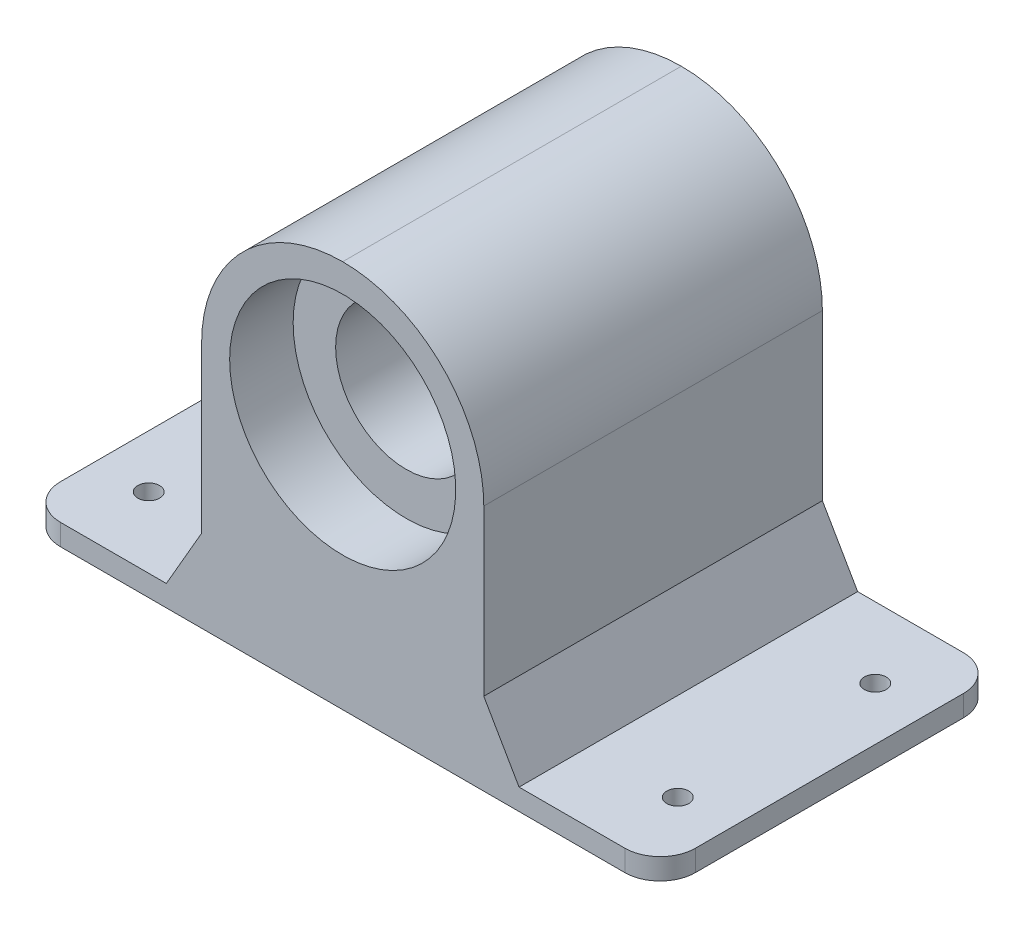
ISO-10303-21;
HEADER;
FILE_DESCRIPTION(('STEP AP214'),'2;1');
FILE_NAME('part.step','',(''),(''),'','','');
FILE_SCHEMA(('AUTOMOTIVE_DESIGN { 1 0 10303 214 1 1 1 1 }'));
ENDSEC;
DATA;
#1=APPLICATION_CONTEXT('core data for automotive mechanical design processes');
#2=APPLICATION_PROTOCOL_DEFINITION('international standard','automotive_design',2000,#1);
#3=PRODUCT_CONTEXT('',#1,'mechanical');
#4=PRODUCT('Part','Part','',(#3));
#5=PRODUCT_RELATED_PRODUCT_CATEGORY('part','',(#4));
#6=PRODUCT_DEFINITION_FORMATION('','',#4);
#7=PRODUCT_DEFINITION_CONTEXT('part definition',#1,'design');
#8=PRODUCT_DEFINITION('design','',#6,#7);
#9=PRODUCT_DEFINITION_SHAPE('','',#8);
#10=(LENGTH_UNIT() NAMED_UNIT(*) SI_UNIT(.MILLI.,.METRE.));
#11=(NAMED_UNIT(*) PLANE_ANGLE_UNIT() SI_UNIT($,.RADIAN.));
#12=(NAMED_UNIT(*) SI_UNIT($,.STERADIAN.) SOLID_ANGLE_UNIT());
#13=UNCERTAINTY_MEASURE_WITH_UNIT(LENGTH_MEASURE(1.E-05),#10,'distance_accuracy_value','');
#14=(GEOMETRIC_REPRESENTATION_CONTEXT(3) GLOBAL_UNCERTAINTY_ASSIGNED_CONTEXT((#13)) GLOBAL_UNIT_ASSIGNED_CONTEXT((#10,
#11,#12)) REPRESENTATION_CONTEXT('',''));
#15=CARTESIAN_POINT('',(0.,0.,0.));
#16=DIRECTION('',(0.,0.,1.));
#17=DIRECTION('',(1.,0.,0.));
#18=AXIS2_PLACEMENT_3D('',#15,#16,#17);
#19=CARTESIAN_POINT('',(20.,0.,24.));
#20=DIRECTION('',(-1.,0.,0.));
#21=DIRECTION('',(0.,0.,1.));
#22=AXIS2_PLACEMENT_3D('',#19,#20,#21);
#23=PLANE('',#22);
#24=DIRECTION('',(0.,1.,0.));
#25=VECTOR('',#24,1.);
#26=CARTESIAN_POINT('',(20.,0.,-24.));
#27=LINE('',#26,#25);
#28=CARTESIAN_POINT('',(20.,-23.3397459621555,-24.));
#29=VERTEX_POINT('',#28);
#30=CARTESIAN_POINT('',(20.,0.,-24.));
#31=VERTEX_POINT('',#30);
#32=EDGE_CURVE('E298',#29,#31,#27,.T.);
#33=ORIENTED_EDGE('',*,*,#32,.T.);
#34=DIRECTION('',(0.,0.,-1.));
#35=VECTOR('',#34,1.);
#36=CARTESIAN_POINT('',(20.,0.,24.));
#37=LINE('',#36,#35);
#38=CARTESIAN_POINT('',(20.,0.,24.));
#39=VERTEX_POINT('',#38);
#40=EDGE_CURVE('E209',#31,#39,#37,.F.);
#41=ORIENTED_EDGE('',*,*,#40,.T.);
#42=DIRECTION('',(0.,1.,0.));
#43=VECTOR('',#42,1.);
#44=CARTESIAN_POINT('',(20.,-35.,24.));
#45=LINE('',#44,#43);
#46=CARTESIAN_POINT('',(20.,-23.3397459621555,24.));
#47=VERTEX_POINT('',#46);
#48=EDGE_CURVE('E170',#47,#39,#45,.T.);
#49=ORIENTED_EDGE('',*,*,#48,.F.);
#50=DIRECTION('',(0.,0.,-1.));
#51=VECTOR('',#50,1.);
#52=CARTESIAN_POINT('',(20.,-23.3397459621555,-24.));
#53=LINE('',#52,#51);
#54=EDGE_CURVE('E183',#47,#29,#53,.T.);
#55=ORIENTED_EDGE('',*,*,#54,.T.);
#56=EDGE_LOOP('',(#33,#41,#49,#55));
#57=FACE_BOUND('',#56,.T.);
#58=ADVANCED_FACE('F35',(#57),#23,.F.);
#59=CARTESIAN_POINT('',(0.,0.,24.));
#60=DIRECTION('',(0.,0.,-1.));
#61=DIRECTION('',(-1.,0.,0.));
#62=AXIS2_PLACEMENT_3D('',#59,#60,#61);
#63=CYLINDRICAL_SURFACE('',#62,10.);
#64=CARTESIAN_POINT('',(0.,0.,-15.));
#65=DIRECTION('',(0.,0.,-1.));
#66=DIRECTION('',(-1.,0.,0.));
#67=AXIS2_PLACEMENT_3D('',#64,#65,#66);
#68=CIRCLE('',#67,10.);
#69=CARTESIAN_POINT('',(-10.,0.,-15.));
#70=VERTEX_POINT('',#69);
#71=EDGE_CURVE('E152',#70,#70,#68,.T.);
#72=ORIENTED_EDGE('',*,*,#71,.T.);
#73=EDGE_LOOP('',(#72));
#74=FACE_BOUND('',#73,.T.);
#75=CARTESIAN_POINT('',(0.,0.,15.));
#76=DIRECTION('',(0.,0.,1.));
#77=DIRECTION('',(1.,0.,0.));
#78=AXIS2_PLACEMENT_3D('',#75,#76,#77);
#79=CIRCLE('',#78,10.);
#80=CARTESIAN_POINT('',(10.,0.,15.));
#81=VERTEX_POINT('',#80);
#82=EDGE_CURVE('E178',#81,#81,#79,.T.);
#83=ORIENTED_EDGE('',*,*,#82,.T.);
#84=EDGE_LOOP('',(#83));
#85=FACE_BOUND('',#84,.T.);
#86=ADVANCED_FACE('F306',(#74,#85),#63,.F.);
#87=CARTESIAN_POINT('',(0.,0.,24.));
#88=DIRECTION('',(0.,0.,1.));
#89=DIRECTION('',(1.,0.,0.));
#90=AXIS2_PLACEMENT_3D('',#87,#88,#89);
#91=PLANE('',#90);
#92=CARTESIAN_POINT('',(0.,0.,24.));
#93=DIRECTION('',(0.,0.,-1.));
#94=DIRECTION('',(-1.,0.,0.));
#95=AXIS2_PLACEMENT_3D('',#92,#93,#94);
#96=CIRCLE('',#95,16.025);
#97=CARTESIAN_POINT('',(-16.025,0.,24.));
#98=VERTEX_POINT('',#97);
#99=EDGE_CURVE('E284',#98,#98,#96,.T.);
#100=ORIENTED_EDGE('',*,*,#99,.T.);
#101=EDGE_LOOP('',(#100));
#102=FACE_BOUND('',#101,.T.);
#103=DIRECTION('',(1.,0.,0.));
#104=VECTOR('',#103,1.);
#105=CARTESIAN_POINT('',(-20.,-35.,24.));
#106=LINE('',#105,#104);
#107=CARTESIAN_POINT('',(-40.,-35.,24.));
#108=VERTEX_POINT('',#107);
#109=CARTESIAN_POINT('',(40.,-35.,24.));
#110=VERTEX_POINT('',#109);
#111=EDGE_CURVE('E175',#108,#110,#106,.T.);
#112=ORIENTED_EDGE('',*,*,#111,.T.);
#113=DIRECTION('',(0.,-1.,0.));
#114=VECTOR('',#113,1.);
#115=CARTESIAN_POINT('',(40.,-32.,24.));
#116=LINE('',#115,#114);
#117=CARTESIAN_POINT('',(40.,-32.,24.));
#118=VERTEX_POINT('',#117);
#119=EDGE_CURVE('E238',#110,#118,#116,.F.);
#120=ORIENTED_EDGE('',*,*,#119,.T.);
#121=DIRECTION('',(-1.,0.,0.));
#122=VECTOR('',#121,1.);
#123=CARTESIAN_POINT('',(45.,-32.,24.));
#124=LINE('',#123,#122);
#125=CARTESIAN_POINT('',(25.,-32.,24.));
#126=VERTEX_POINT('',#125);
#127=EDGE_CURVE('E280',#118,#126,#124,.T.);
#128=ORIENTED_EDGE('',*,*,#127,.T.);
#129=DIRECTION('',(0.499999999999994,-0.866025403784442,0.));
#130=VECTOR('',#129,1.);
#131=CARTESIAN_POINT('',(25.,-32.,24.));
#132=LINE('',#131,#130);
#133=EDGE_CURVE('E163',#126,#47,#132,.F.);
#134=ORIENTED_EDGE('',*,*,#133,.T.);
#135=ORIENTED_EDGE('',*,*,#48,.T.);
#136=CARTESIAN_POINT('',(0.,0.,24.));
#137=DIRECTION('',(0.,0.,1.));
#138=DIRECTION('',(1.,0.,0.));
#139=AXIS2_PLACEMENT_3D('',#136,#137,#138);
#140=CIRCLE('',#139,20.);
#141=CARTESIAN_POINT('',(0.,20.,24.));
#142=VERTEX_POINT('',#141);
#143=EDGE_CURVE('E214',#39,#142,#140,.T.);
#144=ORIENTED_EDGE('',*,*,#143,.T.);
#145=CARTESIAN_POINT('',(0.,0.,24.));
#146=DIRECTION('',(0.,0.,1.));
#147=DIRECTION('',(1.,0.,0.));
#148=AXIS2_PLACEMENT_3D('',#145,#146,#147);
#149=CIRCLE('',#148,20.);
#150=CARTESIAN_POINT('',(-20.,0.,24.));
#151=VERTEX_POINT('',#150);
#152=EDGE_CURVE('E212',#142,#151,#149,.T.);
#153=ORIENTED_EDGE('',*,*,#152,.T.);
#154=DIRECTION('',(0.,-1.,0.));
#155=VECTOR('',#154,1.);
#156=CARTESIAN_POINT('',(-20.,0.,24.));
#157=LINE('',#156,#155);
#158=CARTESIAN_POINT('',(-20.,-23.3397459621555,24.));
#159=VERTEX_POINT('',#158);
#160=EDGE_CURVE('E296',#151,#159,#157,.T.);
#161=ORIENTED_EDGE('',*,*,#160,.T.);
#162=DIRECTION('',(-0.499999999999994,-0.866025403784442,0.));
#163=VECTOR('',#162,1.);
#164=CARTESIAN_POINT('',(-20.,-23.3397459621555,24.));
#165=LINE('',#164,#163);
#166=CARTESIAN_POINT('',(-25.,-32.,24.));
#167=VERTEX_POINT('',#166);
#168=EDGE_CURVE('E164',#159,#167,#165,.T.);
#169=ORIENTED_EDGE('',*,*,#168,.T.);
#170=DIRECTION('',(1.,0.,0.));
#171=VECTOR('',#170,1.);
#172=CARTESIAN_POINT('',(-45.,-32.,24.));
#173=LINE('',#172,#171);
#174=CARTESIAN_POINT('',(-40.,-32.,24.));
#175=VERTEX_POINT('',#174);
#176=EDGE_CURVE('E253',#175,#167,#173,.T.);
#177=ORIENTED_EDGE('',*,*,#176,.F.);
#178=DIRECTION('',(0.,-1.,0.));
#179=VECTOR('',#178,1.);
#180=CARTESIAN_POINT('',(-40.,-35.,24.));
#181=LINE('',#180,#179);
#182=EDGE_CURVE('E235',#175,#108,#181,.T.);
#183=ORIENTED_EDGE('',*,*,#182,.T.);
#184=EDGE_LOOP('',(#112,#120,#128,#134,#135,#144,#153,#161,#169,#177,#183));
#185=FACE_BOUND('',#184,.T.);
#186=ADVANCED_FACE('F258',(#102,#185),#91,.T.);
#187=CARTESIAN_POINT('',(0.,0.,-24.));
#188=DIRECTION('',(0.,0.,1.));
#189=DIRECTION('',(1.,0.,0.));
#190=AXIS2_PLACEMENT_3D('',#187,#188,#189);
#191=PLANE('',#190);
#192=CARTESIAN_POINT('',(0.,0.,-24.));
#193=DIRECTION('',(0.,0.,-1.));
#194=DIRECTION('',(-1.,0.,0.));
#195=AXIS2_PLACEMENT_3D('',#192,#193,#194);
#196=CIRCLE('',#195,16.025);
#197=CARTESIAN_POINT('',(-16.025,0.,-24.));
#198=VERTEX_POINT('',#197);
#199=EDGE_CURVE('E293',#198,#198,#196,.T.);
#200=ORIENTED_EDGE('',*,*,#199,.F.);
#201=EDGE_LOOP('',(#200));
#202=FACE_BOUND('',#201,.T.);
#203=DIRECTION('',(-1.,0.,0.));
#204=VECTOR('',#203,1.);
#205=CARTESIAN_POINT('',(45.,-32.,-24.));
#206=LINE('',#205,#204);
#207=CARTESIAN_POINT('',(40.,-32.,-24.));
#208=VERTEX_POINT('',#207);
#209=CARTESIAN_POINT('',(25.,-32.,-24.));
#210=VERTEX_POINT('',#209);
#211=EDGE_CURVE('E282',#208,#210,#206,.T.);
#212=ORIENTED_EDGE('',*,*,#211,.F.);
#213=DIRECTION('',(0.,1.,0.));
#214=VECTOR('',#213,1.);
#215=CARTESIAN_POINT('',(40.,0.,-24.));
#216=LINE('',#215,#214);
#217=CARTESIAN_POINT('',(40.,-35.,-24.));
#218=VERTEX_POINT('',#217);
#219=EDGE_CURVE('E246',#208,#218,#216,.F.);
#220=ORIENTED_EDGE('',*,*,#219,.T.);
#221=DIRECTION('',(1.,0.,0.));
#222=VECTOR('',#221,1.);
#223=CARTESIAN_POINT('',(-20.,-35.,-24.));
#224=LINE('',#223,#222);
#225=CARTESIAN_POINT('',(-40.,-35.,-24.));
#226=VERTEX_POINT('',#225);
#227=EDGE_CURVE('E151',#226,#218,#224,.T.);
#228=ORIENTED_EDGE('',*,*,#227,.F.);
#229=DIRECTION('',(0.,1.,0.));
#230=VECTOR('',#229,1.);
#231=CARTESIAN_POINT('',(-40.,0.,-24.));
#232=LINE('',#231,#230);
#233=CARTESIAN_POINT('',(-40.,-32.,-24.));
#234=VERTEX_POINT('',#233);
#235=EDGE_CURVE('E244',#226,#234,#232,.T.);
#236=ORIENTED_EDGE('',*,*,#235,.T.);
#237=DIRECTION('',(1.,0.,0.));
#238=VECTOR('',#237,1.);
#239=CARTESIAN_POINT('',(-45.,-32.,-24.));
#240=LINE('',#239,#238);
#241=CARTESIAN_POINT('',(-25.,-32.,-24.));
#242=VERTEX_POINT('',#241);
#243=EDGE_CURVE('E159',#234,#242,#240,.T.);
#244=ORIENTED_EDGE('',*,*,#243,.T.);
#245=DIRECTION('',(0.499999999999994,0.866025403784442,0.));
#246=VECTOR('',#245,1.);
#247=CARTESIAN_POINT('',(-4.89359353944923,2.82531754730558,-24.));
#248=LINE('',#247,#246);
#249=CARTESIAN_POINT('',(-20.,-23.3397459621555,-24.));
#250=VERTEX_POINT('',#249);
#251=EDGE_CURVE('E155',#242,#250,#248,.T.);
#252=ORIENTED_EDGE('',*,*,#251,.T.);
#253=DIRECTION('',(0.,-1.,0.));
#254=VECTOR('',#253,1.);
#255=CARTESIAN_POINT('',(-20.,-35.,-24.));
#256=LINE('',#255,#254);
#257=CARTESIAN_POINT('',(-20.,0.,-24.));
#258=VERTEX_POINT('',#257);
#259=EDGE_CURVE('E141',#258,#250,#256,.T.);
#260=ORIENTED_EDGE('',*,*,#259,.F.);
#261=CARTESIAN_POINT('',(0.,0.,-24.));
#262=DIRECTION('',(0.,0.,1.));
#263=DIRECTION('',(1.,0.,0.));
#264=AXIS2_PLACEMENT_3D('',#261,#262,#263);
#265=CIRCLE('',#264,20.);
#266=CARTESIAN_POINT('',(0.,20.,-24.));
#267=VERTEX_POINT('',#266);
#268=EDGE_CURVE('E190',#258,#267,#265,.F.);
#269=ORIENTED_EDGE('',*,*,#268,.T.);
#270=CARTESIAN_POINT('',(0.,0.,-24.));
#271=DIRECTION('',(0.,0.,1.));
#272=DIRECTION('',(1.,0.,0.));
#273=AXIS2_PLACEMENT_3D('',#270,#271,#272);
#274=CIRCLE('',#273,20.);
#275=EDGE_CURVE('E207',#267,#31,#274,.F.);
#276=ORIENTED_EDGE('',*,*,#275,.T.);
#277=ORIENTED_EDGE('',*,*,#32,.F.);
#278=DIRECTION('',(-0.499999999999994,0.866025403784442,0.));
#279=VECTOR('',#278,1.);
#280=CARTESIAN_POINT('',(4.89359353944923,2.82531754730558,-24.));
#281=LINE('',#280,#279);
#282=EDGE_CURVE('E187',#29,#210,#281,.F.);
#283=ORIENTED_EDGE('',*,*,#282,.T.);
#284=EDGE_LOOP('',(#212,#220,#228,#236,#244,#252,#260,#269,#276,#277,#283));
#285=FACE_BOUND('',#284,.T.);
#286=ADVANCED_FACE('F157',(#202,#285),#191,.F.);
#287=CARTESIAN_POINT('',(-20.,-35.,24.));
#288=DIRECTION('',(1.,0.,0.));
#289=DIRECTION('',(0.,0.,-1.));
#290=AXIS2_PLACEMENT_3D('',#287,#288,#289);
#291=PLANE('',#290);
#292=ORIENTED_EDGE('',*,*,#160,.F.);
#293=DIRECTION('',(0.,0.,-1.));
#294=VECTOR('',#293,1.);
#295=CARTESIAN_POINT('',(-20.,0.,24.));
#296=LINE('',#295,#294);
#297=EDGE_CURVE('E148',#151,#258,#296,.T.);
#298=ORIENTED_EDGE('',*,*,#297,.T.);
#299=ORIENTED_EDGE('',*,*,#259,.T.);
#300=DIRECTION('',(0.,0.,1.));
#301=VECTOR('',#300,1.);
#302=CARTESIAN_POINT('',(-20.,-23.3397459621555,24.));
#303=LINE('',#302,#301);
#304=EDGE_CURVE('E146',#250,#159,#303,.T.);
#305=ORIENTED_EDGE('',*,*,#304,.T.);
#306=EDGE_LOOP('',(#292,#298,#299,#305));
#307=FACE_BOUND('',#306,.T.);
#308=ADVANCED_FACE('F144',(#307),#291,.F.);
#309=CARTESIAN_POINT('',(-20.,-35.,24.));
#310=DIRECTION('',(0.,1.,0.));
#311=DIRECTION('',(0.,0.,1.));
#312=AXIS2_PLACEMENT_3D('',#309,#310,#311);
#313=PLANE('',#312);
#314=CARTESIAN_POINT('',(37.5,-35.,-14.));
#315=DIRECTION('',(0.,-1.,0.));
#316=DIRECTION('',(0.,0.,-1.));
#317=AXIS2_PLACEMENT_3D('',#314,#315,#316);
#318=CIRCLE('',#317,1.55);
#319=CARTESIAN_POINT('',(37.5,-35.,-15.55));
#320=VERTEX_POINT('',#319);
#321=EDGE_CURVE('E200',#320,#320,#318,.T.);
#322=ORIENTED_EDGE('',*,*,#321,.F.);
#323=EDGE_LOOP('',(#322));
#324=FACE_BOUND('',#323,.T.);
#325=CARTESIAN_POINT('',(-37.5,-35.,14.));
#326=DIRECTION('',(0.,-1.,0.));
#327=DIRECTION('',(0.,0.,1.));
#328=AXIS2_PLACEMENT_3D('',#325,#326,#327);
#329=CIRCLE('',#328,1.55);
#330=CARTESIAN_POINT('',(-37.5,-35.,15.55));
#331=VERTEX_POINT('',#330);
#332=EDGE_CURVE('E577',#331,#331,#329,.T.);
#333=ORIENTED_EDGE('',*,*,#332,.F.);
#334=EDGE_LOOP('',(#333));
#335=FACE_BOUND('',#334,.T.);
#336=CARTESIAN_POINT('',(-37.5,-35.,-14.));
#337=DIRECTION('',(0.,-1.,0.));
#338=DIRECTION('',(0.,0.,1.));
#339=AXIS2_PLACEMENT_3D('',#336,#337,#338);
#340=CIRCLE('',#339,1.55);
#341=CARTESIAN_POINT('',(-37.5,-35.,-12.45));
#342=VERTEX_POINT('',#341);
#343=EDGE_CURVE('E221',#342,#342,#340,.T.);
#344=ORIENTED_EDGE('',*,*,#343,.F.);
#345=EDGE_LOOP('',(#344));
#346=FACE_BOUND('',#345,.T.);
#347=CARTESIAN_POINT('',(37.5,-35.,14.));
#348=DIRECTION('',(0.,-1.,0.));
#349=DIRECTION('',(0.,0.,-1.));
#350=AXIS2_PLACEMENT_3D('',#347,#348,#349);
#351=CIRCLE('',#350,1.55);
#352=CARTESIAN_POINT('',(37.5,-35.,12.45));
#353=VERTEX_POINT('',#352);
#354=EDGE_CURVE('E195',#353,#353,#351,.T.);
#355=ORIENTED_EDGE('',*,*,#354,.F.);
#356=EDGE_LOOP('',(#355));
#357=FACE_BOUND('',#356,.T.);
#358=DIRECTION('',(0.,0.,-1.));
#359=VECTOR('',#358,1.);
#360=CARTESIAN_POINT('',(45.,-35.,24.));
#361=LINE('',#360,#359);
#362=CARTESIAN_POINT('',(45.,-35.,19.));
#363=VERTEX_POINT('',#362);
#364=CARTESIAN_POINT('',(45.,-35.,-19.));
#365=VERTEX_POINT('',#364);
#366=EDGE_CURVE('E260',#363,#365,#361,.T.);
#367=ORIENTED_EDGE('',*,*,#366,.F.);
#368=CARTESIAN_POINT('',(40.,-35.,19.));
#369=DIRECTION('',(0.,1.,0.));
#370=DIRECTION('',(0.,0.,1.));
#371=AXIS2_PLACEMENT_3D('',#368,#369,#370);
#372=CIRCLE('',#371,5.);
#373=EDGE_CURVE('E233',#363,#110,#372,.F.);
#374=ORIENTED_EDGE('',*,*,#373,.T.);
#375=ORIENTED_EDGE('',*,*,#111,.F.);
#376=CARTESIAN_POINT('',(-40.,-35.,19.));
#377=DIRECTION('',(0.,1.,0.));
#378=DIRECTION('',(0.,0.,1.));
#379=AXIS2_PLACEMENT_3D('',#376,#377,#378);
#380=CIRCLE('',#379,5.);
#381=CARTESIAN_POINT('',(-45.,-35.,19.));
#382=VERTEX_POINT('',#381);
#383=EDGE_CURVE('E227',#108,#382,#380,.F.);
#384=ORIENTED_EDGE('',*,*,#383,.T.);
#385=DIRECTION('',(0.,0.,-1.));
#386=VECTOR('',#385,1.);
#387=CARTESIAN_POINT('',(-45.,-35.,24.));
#388=LINE('',#387,#386);
#389=CARTESIAN_POINT('',(-45.,-35.,-19.));
#390=VERTEX_POINT('',#389);
#391=EDGE_CURVE('E266',#382,#390,#388,.T.);
#392=ORIENTED_EDGE('',*,*,#391,.T.);
#393=CARTESIAN_POINT('',(-40.,-35.,-19.));
#394=DIRECTION('',(0.,1.,0.));
#395=DIRECTION('',(0.,0.,1.));
#396=AXIS2_PLACEMENT_3D('',#393,#394,#395);
#397=CIRCLE('',#396,5.);
#398=EDGE_CURVE('E229',#390,#226,#397,.F.);
#399=ORIENTED_EDGE('',*,*,#398,.T.);
#400=ORIENTED_EDGE('',*,*,#227,.T.);
#401=CARTESIAN_POINT('',(40.,-35.,-19.));
#402=DIRECTION('',(0.,1.,0.));
#403=DIRECTION('',(0.,0.,1.));
#404=AXIS2_PLACEMENT_3D('',#401,#402,#403);
#405=CIRCLE('',#404,5.);
#406=EDGE_CURVE('E231',#218,#365,#405,.F.);
#407=ORIENTED_EDGE('',*,*,#406,.T.);
#408=EDGE_LOOP('',(#367,#374,#375,#384,#392,#399,#400,#407));
#409=FACE_BOUND('',#408,.T.);
#410=ADVANCED_FACE('F265',(#324,#335,#346,#357,#409),#313,.F.);
#411=CARTESIAN_POINT('',(0.,0.,-15.));
#412=DIRECTION('',(0.,0.,-1.));
#413=DIRECTION('',(-1.,0.,0.));
#414=AXIS2_PLACEMENT_3D('',#411,#412,#413);
#415=CYLINDRICAL_SURFACE('',#414,16.025);
#416=CARTESIAN_POINT('',(0.,0.,-15.));
#417=DIRECTION('',(0.,0.,-1.));
#418=DIRECTION('',(-1.,0.,0.));
#419=AXIS2_PLACEMENT_3D('',#416,#417,#418);
#420=CIRCLE('',#419,16.025);
#421=CARTESIAN_POINT('',(-16.025,0.,-15.));
#422=VERTEX_POINT('',#421);
#423=EDGE_CURVE('E290',#422,#422,#420,.T.);
#424=ORIENTED_EDGE('',*,*,#423,.F.);
#425=EDGE_LOOP('',(#424));
#426=FACE_BOUND('',#425,.T.);
#427=ORIENTED_EDGE('',*,*,#199,.T.);
#428=EDGE_LOOP('',(#427));
#429=FACE_BOUND('',#428,.T.);
#430=ADVANCED_FACE('F313',(#426,#429),#415,.F.);
#431=CARTESIAN_POINT('',(0.,0.,-15.));
#432=DIRECTION('',(0.,0.,-1.));
#433=DIRECTION('',(-1.,0.,0.));
#434=AXIS2_PLACEMENT_3D('',#431,#432,#433);
#435=PLANE('',#434);
#436=ORIENTED_EDGE('',*,*,#71,.F.);
#437=EDGE_LOOP('',(#436));
#438=FACE_BOUND('',#437,.T.);
#439=ORIENTED_EDGE('',*,*,#423,.T.);
#440=EDGE_LOOP('',(#439));
#441=FACE_BOUND('',#440,.T.);
#442=ADVANCED_FACE('F309',(#438,#441),#435,.T.);
#443=CARTESIAN_POINT('',(0.,0.,15.));
#444=DIRECTION('',(0.,0.,1.));
#445=DIRECTION('',(1.,0.,0.));
#446=AXIS2_PLACEMENT_3D('',#443,#444,#445);
#447=CYLINDRICAL_SURFACE('',#446,16.025);
#448=CARTESIAN_POINT('',(0.,0.,15.));
#449=DIRECTION('',(0.,0.,-1.));
#450=DIRECTION('',(-1.,0.,0.));
#451=AXIS2_PLACEMENT_3D('',#448,#449,#450);
#452=CIRCLE('',#451,16.025);
#453=CARTESIAN_POINT('',(-16.025,0.,15.));
#454=VERTEX_POINT('',#453);
#455=EDGE_CURVE('E285',#454,#454,#452,.T.);
#456=ORIENTED_EDGE('',*,*,#455,.T.);
#457=EDGE_LOOP('',(#456));
#458=FACE_BOUND('',#457,.T.);
#459=ORIENTED_EDGE('',*,*,#99,.F.);
#460=EDGE_LOOP('',(#459));
#461=FACE_BOUND('',#460,.T.);
#462=ADVANCED_FACE('F312',(#458,#461),#447,.F.);
#463=CARTESIAN_POINT('',(0.,0.,15.));
#464=DIRECTION('',(0.,0.,1.));
#465=DIRECTION('',(-1.,0.,0.));
#466=AXIS2_PLACEMENT_3D('',#463,#464,#465);
#467=PLANE('',#466);
#468=ORIENTED_EDGE('',*,*,#82,.F.);
#469=EDGE_LOOP('',(#468));
#470=FACE_BOUND('',#469,.T.);
#471=ORIENTED_EDGE('',*,*,#455,.F.);
#472=EDGE_LOOP('',(#471));
#473=FACE_BOUND('',#472,.T.);
#474=ADVANCED_FACE('F396',(#470,#473),#467,.T.);
#475=CARTESIAN_POINT('',(45.,-32.,24.));
#476=DIRECTION('',(0.,-1.,0.));
#477=DIRECTION('',(0.,0.,-1.));
#478=AXIS2_PLACEMENT_3D('',#475,#476,#477);
#479=PLANE('',#478);
#480=CARTESIAN_POINT('',(37.5,-32.,-14.));
#481=DIRECTION('',(0.,-1.,0.));
#482=DIRECTION('',(0.,0.,-1.));
#483=AXIS2_PLACEMENT_3D('',#480,#481,#482);
#484=CIRCLE('',#483,1.55);
#485=CARTESIAN_POINT('',(37.5,-32.,-15.55));
#486=VERTEX_POINT('',#485);
#487=EDGE_CURVE('E203',#486,#486,#484,.T.);
#488=ORIENTED_EDGE('',*,*,#487,.T.);
#489=EDGE_LOOP('',(#488));
#490=FACE_BOUND('',#489,.T.);
#491=CARTESIAN_POINT('',(37.5,-32.,14.));
#492=DIRECTION('',(0.,-1.,0.));
#493=DIRECTION('',(0.,0.,-1.));
#494=AXIS2_PLACEMENT_3D('',#491,#492,#493);
#495=CIRCLE('',#494,1.55);
#496=CARTESIAN_POINT('',(37.5,-32.,12.45));
#497=VERTEX_POINT('',#496);
#498=EDGE_CURVE('E191',#497,#497,#495,.T.);
#499=ORIENTED_EDGE('',*,*,#498,.T.);
#500=EDGE_LOOP('',(#499));
#501=FACE_BOUND('',#500,.T.);
#502=ORIENTED_EDGE('',*,*,#127,.F.);
#503=CARTESIAN_POINT('',(40.,-32.,19.));
#504=DIRECTION('',(0.,-1.,0.));
#505=DIRECTION('',(0.,0.,-1.));
#506=AXIS2_PLACEMENT_3D('',#503,#504,#505);
#507=CIRCLE('',#506,5.);
#508=CARTESIAN_POINT('',(45.,-32.,19.));
#509=VERTEX_POINT('',#508);
#510=EDGE_CURVE('E242',#118,#509,#507,.F.);
#511=ORIENTED_EDGE('',*,*,#510,.T.);
#512=DIRECTION('',(0.,0.,1.));
#513=VECTOR('',#512,1.);
#514=CARTESIAN_POINT('',(45.,-32.,24.));
#515=LINE('',#514,#513);
#516=CARTESIAN_POINT('',(45.,-32.,-19.));
#517=VERTEX_POINT('',#516);
#518=EDGE_CURVE('E277',#517,#509,#515,.T.);
#519=ORIENTED_EDGE('',*,*,#518,.F.);
#520=CARTESIAN_POINT('',(40.,-32.,-19.));
#521=DIRECTION('',(0.,-1.,0.));
#522=DIRECTION('',(0.,0.,-1.));
#523=AXIS2_PLACEMENT_3D('',#520,#521,#522);
#524=CIRCLE('',#523,5.);
#525=EDGE_CURVE('E240',#517,#208,#524,.F.);
#526=ORIENTED_EDGE('',*,*,#525,.T.);
#527=ORIENTED_EDGE('',*,*,#211,.T.);
#528=DIRECTION('',(0.,0.,1.));
#529=VECTOR('',#528,1.);
#530=CARTESIAN_POINT('',(25.,-32.,24.));
#531=LINE('',#530,#529);
#532=EDGE_CURVE('E172',#210,#126,#531,.T.);
#533=ORIENTED_EDGE('',*,*,#532,.T.);
#534=EDGE_LOOP('',(#502,#511,#519,#526,#527,#533));
#535=FACE_BOUND('',#534,.T.);
#536=ADVANCED_FACE('F385',(#490,#501,#535),#479,.F.);
#537=CARTESIAN_POINT('',(45.,0.,0.));
#538=DIRECTION('',(-1.,0.,0.));
#539=DIRECTION('',(0.,0.,1.));
#540=AXIS2_PLACEMENT_3D('',#537,#538,#539);
#541=PLANE('',#540);
#542=ORIENTED_EDGE('',*,*,#518,.T.);
#543=DIRECTION('',(0.,-1.,0.));
#544=VECTOR('',#543,1.);
#545=CARTESIAN_POINT('',(45.,-35.,19.));
#546=LINE('',#545,#544);
#547=EDGE_CURVE('E224',#509,#363,#546,.T.);
#548=ORIENTED_EDGE('',*,*,#547,.T.);
#549=ORIENTED_EDGE('',*,*,#366,.T.);
#550=DIRECTION('',(0.,1.,0.));
#551=VECTOR('',#550,1.);
#552=CARTESIAN_POINT('',(45.,0.,-19.));
#553=LINE('',#552,#551);
#554=EDGE_CURVE('E217',#365,#517,#553,.T.);
#555=ORIENTED_EDGE('',*,*,#554,.T.);
#556=EDGE_LOOP('',(#542,#548,#549,#555));
#557=FACE_BOUND('',#556,.T.);
#558=ADVANCED_FACE('F377',(#557),#541,.F.);
#559=CARTESIAN_POINT('',(-45.,-32.,24.));
#560=DIRECTION('',(0.,1.,0.));
#561=DIRECTION('',(0.,0.,1.));
#562=AXIS2_PLACEMENT_3D('',#559,#560,#561);
#563=PLANE('',#562);
#564=CARTESIAN_POINT('',(-37.5,-32.,14.));
#565=DIRECTION('',(0.,1.,0.));
#566=DIRECTION('',(0.,0.,1.));
#567=AXIS2_PLACEMENT_3D('',#564,#565,#566);
#568=CIRCLE('',#567,1.55);
#569=CARTESIAN_POINT('',(-37.5,-32.,15.55));
#570=VERTEX_POINT('',#569);
#571=EDGE_CURVE('E199',#570,#570,#568,.T.);
#572=ORIENTED_EDGE('',*,*,#571,.F.);
#573=EDGE_LOOP('',(#572));
#574=FACE_BOUND('',#573,.T.);
#575=CARTESIAN_POINT('',(-37.5,-32.,-14.));
#576=DIRECTION('',(0.,1.,0.));
#577=DIRECTION('',(0.,0.,1.));
#578=AXIS2_PLACEMENT_3D('',#575,#576,#577);
#579=CIRCLE('',#578,1.55);
#580=CARTESIAN_POINT('',(-37.5,-32.,-12.45));
#581=VERTEX_POINT('',#580);
#582=EDGE_CURVE('E196',#581,#581,#579,.T.);
#583=ORIENTED_EDGE('',*,*,#582,.F.);
#584=EDGE_LOOP('',(#583));
#585=FACE_BOUND('',#584,.T.);
#586=ORIENTED_EDGE('',*,*,#243,.F.);
#587=CARTESIAN_POINT('',(-40.,-32.,-19.));
#588=DIRECTION('',(0.,1.,0.));
#589=DIRECTION('',(0.,0.,1.));
#590=AXIS2_PLACEMENT_3D('',#587,#588,#589);
#591=CIRCLE('',#590,5.);
#592=CARTESIAN_POINT('',(-45.,-32.,-19.));
#593=VERTEX_POINT('',#592);
#594=EDGE_CURVE('E56',#234,#593,#591,.T.);
#595=ORIENTED_EDGE('',*,*,#594,.T.);
#596=DIRECTION('',(0.,0.,1.));
#597=VECTOR('',#596,1.);
#598=CARTESIAN_POINT('',(-45.,-32.,24.));
#599=LINE('',#598,#597);
#600=CARTESIAN_POINT('',(-45.,-32.,19.));
#601=VERTEX_POINT('',#600);
#602=EDGE_CURVE('E194',#593,#601,#599,.T.);
#603=ORIENTED_EDGE('',*,*,#602,.T.);
#604=CARTESIAN_POINT('',(-40.,-32.,19.));
#605=DIRECTION('',(0.,1.,0.));
#606=DIRECTION('',(0.,0.,1.));
#607=AXIS2_PLACEMENT_3D('',#604,#605,#606);
#608=CIRCLE('',#607,5.);
#609=EDGE_CURVE('E248',#601,#175,#608,.T.);
#610=ORIENTED_EDGE('',*,*,#609,.T.);
#611=ORIENTED_EDGE('',*,*,#176,.T.);
#612=DIRECTION('',(0.,0.,-1.));
#613=VECTOR('',#612,1.);
#614=CARTESIAN_POINT('',(-25.,-32.,24.));
#615=LINE('',#614,#613);
#616=EDGE_CURVE('E169',#167,#242,#615,.T.);
#617=ORIENTED_EDGE('',*,*,#616,.T.);
#618=EDGE_LOOP('',(#586,#595,#603,#610,#611,#617));
#619=FACE_BOUND('',#618,.T.);
#620=ADVANCED_FACE('F252',(#574,#585,#619),#563,.T.);
#621=CARTESIAN_POINT('',(-45.,0.,0.));
#622=DIRECTION('',(1.,0.,0.));
#623=DIRECTION('',(0.,0.,1.));
#624=AXIS2_PLACEMENT_3D('',#621,#622,#623);
#625=PLANE('',#624);
#626=ORIENTED_EDGE('',*,*,#602,.F.);
#627=DIRECTION('',(0.,1.,0.));
#628=VECTOR('',#627,1.);
#629=CARTESIAN_POINT('',(-45.,0.,-19.));
#630=LINE('',#629,#628);
#631=EDGE_CURVE('E11',#593,#390,#630,.F.);
#632=ORIENTED_EDGE('',*,*,#631,.T.);
#633=ORIENTED_EDGE('',*,*,#391,.F.);
#634=DIRECTION('',(0.,-1.,0.));
#635=VECTOR('',#634,1.);
#636=CARTESIAN_POINT('',(-45.,-32.,19.));
#637=LINE('',#636,#635);
#638=EDGE_CURVE('E43',#382,#601,#637,.F.);
#639=ORIENTED_EDGE('',*,*,#638,.T.);
#640=EDGE_LOOP('',(#626,#632,#633,#639));
#641=FACE_BOUND('',#640,.T.);
#642=ADVANCED_FACE('F268',(#641),#625,.F.);
#643=CARTESIAN_POINT('',(-20.,-23.3397459621555,24.));
#644=DIRECTION('',(0.866025403784442,-0.499999999999994,0.));
#645=DIRECTION('',(0.,0.,1.));
#646=AXIS2_PLACEMENT_3D('',#643,#644,#645);
#647=PLANE('',#646);
#648=ORIENTED_EDGE('',*,*,#251,.F.);
#649=ORIENTED_EDGE('',*,*,#616,.F.);
#650=ORIENTED_EDGE('',*,*,#168,.F.);
#651=ORIENTED_EDGE('',*,*,#304,.F.);
#652=EDGE_LOOP('',(#648,#649,#650,#651));
#653=FACE_BOUND('',#652,.T.);
#654=ADVANCED_FACE('F167',(#653),#647,.F.);
#655=CARTESIAN_POINT('',(25.,-32.,24.));
#656=DIRECTION('',(0.866025403784442,0.499999999999994,0.));
#657=DIRECTION('',(0.,0.,-1.));
#658=AXIS2_PLACEMENT_3D('',#655,#656,#657);
#659=PLANE('',#658);
#660=ORIENTED_EDGE('',*,*,#282,.F.);
#661=ORIENTED_EDGE('',*,*,#54,.F.);
#662=ORIENTED_EDGE('',*,*,#133,.F.);
#663=ORIENTED_EDGE('',*,*,#532,.F.);
#664=EDGE_LOOP('',(#660,#661,#662,#663));
#665=FACE_BOUND('',#664,.T.);
#666=ADVANCED_FACE('F344',(#665),#659,.T.);
#667=CARTESIAN_POINT('',(37.5,20.,14.));
#668=DIRECTION('',(0.,-1.,0.));
#669=DIRECTION('',(0.,0.,-1.));
#670=AXIS2_PLACEMENT_3D('',#667,#668,#669);
#671=CYLINDRICAL_SURFACE('',#670,1.55);
#672=ORIENTED_EDGE('',*,*,#354,.T.);
#673=EDGE_LOOP('',(#672));
#674=FACE_BOUND('',#673,.T.);
#675=ORIENTED_EDGE('',*,*,#498,.F.);
#676=EDGE_LOOP('',(#675));
#677=FACE_BOUND('',#676,.T.);
#678=ADVANCED_FACE('F347',(#674,#677),#671,.F.);
#679=CARTESIAN_POINT('',(-37.5,20.,-14.));
#680=DIRECTION('',(0.,-1.,0.));
#681=DIRECTION('',(0.,0.,-1.));
#682=AXIS2_PLACEMENT_3D('',#679,#680,#681);
#683=CYLINDRICAL_SURFACE('',#682,1.55);
#684=ORIENTED_EDGE('',*,*,#582,.T.);
#685=EDGE_LOOP('',(#684));
#686=FACE_BOUND('',#685,.T.);
#687=ORIENTED_EDGE('',*,*,#343,.T.);
#688=EDGE_LOOP('',(#687));
#689=FACE_BOUND('',#688,.T.);
#690=ADVANCED_FACE('F448',(#686,#689),#683,.F.);
#691=CARTESIAN_POINT('',(-37.5,20.,14.));
#692=DIRECTION('',(0.,-1.,0.));
#693=DIRECTION('',(0.,0.,-1.));
#694=AXIS2_PLACEMENT_3D('',#691,#692,#693);
#695=CYLINDRICAL_SURFACE('',#694,1.55);
#696=ORIENTED_EDGE('',*,*,#571,.T.);
#697=EDGE_LOOP('',(#696));
#698=FACE_BOUND('',#697,.T.);
#699=ORIENTED_EDGE('',*,*,#332,.T.);
#700=EDGE_LOOP('',(#699));
#701=FACE_BOUND('',#700,.T.);
#702=ADVANCED_FACE('F458',(#698,#701),#695,.F.);
#703=CARTESIAN_POINT('',(37.5,20.,-14.));
#704=DIRECTION('',(0.,-1.,0.));
#705=DIRECTION('',(0.,0.,-1.));
#706=AXIS2_PLACEMENT_3D('',#703,#704,#705);
#707=CYLINDRICAL_SURFACE('',#706,1.55);
#708=ORIENTED_EDGE('',*,*,#321,.T.);
#709=EDGE_LOOP('',(#708));
#710=FACE_BOUND('',#709,.T.);
#711=ORIENTED_EDGE('',*,*,#487,.F.);
#712=EDGE_LOOP('',(#711));
#713=FACE_BOUND('',#712,.T.);
#714=ADVANCED_FACE('F357',(#710,#713),#707,.F.);
#715=CARTESIAN_POINT('',(0.,0.,24.));
#716=DIRECTION('',(0.,0.,-1.));
#717=DIRECTION('',(-1.,0.,0.));
#718=AXIS2_PLACEMENT_3D('',#715,#716,#717);
#719=CYLINDRICAL_SURFACE('',#718,20.);
#720=ORIENTED_EDGE('',*,*,#297,.F.);
#721=ORIENTED_EDGE('',*,*,#152,.F.);
#722=DIRECTION('',(0.,0.,-1.));
#723=VECTOR('',#722,1.);
#724=CARTESIAN_POINT('',(0.,20.,24.));
#725=LINE('',#724,#723);
#726=EDGE_CURVE('E218',#267,#142,#725,.F.);
#727=ORIENTED_EDGE('',*,*,#726,.F.);
#728=ORIENTED_EDGE('',*,*,#268,.F.);
#729=EDGE_LOOP('',(#720,#721,#727,#728));
#730=FACE_BOUND('',#729,.T.);
#731=ADVANCED_FACE('F353',(#730),#719,.T.);
#732=CARTESIAN_POINT('',(0.,0.,24.));
#733=DIRECTION('',(0.,0.,-1.));
#734=DIRECTION('',(-1.,0.,0.));
#735=AXIS2_PLACEMENT_3D('',#732,#733,#734);
#736=CYLINDRICAL_SURFACE('',#735,20.);
#737=ORIENTED_EDGE('',*,*,#143,.F.);
#738=ORIENTED_EDGE('',*,*,#40,.F.);
#739=ORIENTED_EDGE('',*,*,#275,.F.);
#740=ORIENTED_EDGE('',*,*,#726,.T.);
#741=EDGE_LOOP('',(#737,#738,#739,#740));
#742=FACE_BOUND('',#741,.T.);
#743=ADVANCED_FACE('F349',(#742),#736,.T.);
#744=CARTESIAN_POINT('',(40.,0.,19.));
#745=DIRECTION('',(0.,1.,0.));
#746=DIRECTION('',(0.,0.,1.));
#747=AXIS2_PLACEMENT_3D('',#744,#745,#746);
#748=CYLINDRICAL_SURFACE('',#747,5.);
#749=ORIENTED_EDGE('',*,*,#510,.F.);
#750=ORIENTED_EDGE('',*,*,#119,.F.);
#751=ORIENTED_EDGE('',*,*,#373,.F.);
#752=ORIENTED_EDGE('',*,*,#547,.F.);
#753=EDGE_LOOP('',(#749,#750,#751,#752));
#754=FACE_BOUND('',#753,.T.);
#755=ADVANCED_FACE('F352',(#754),#748,.T.);
#756=CARTESIAN_POINT('',(40.,0.,-19.));
#757=DIRECTION('',(0.,1.,0.));
#758=DIRECTION('',(0.,0.,1.));
#759=AXIS2_PLACEMENT_3D('',#756,#757,#758);
#760=CYLINDRICAL_SURFACE('',#759,5.);
#761=ORIENTED_EDGE('',*,*,#406,.F.);
#762=ORIENTED_EDGE('',*,*,#219,.F.);
#763=ORIENTED_EDGE('',*,*,#525,.F.);
#764=ORIENTED_EDGE('',*,*,#554,.F.);
#765=EDGE_LOOP('',(#761,#762,#763,#764));
#766=FACE_BOUND('',#765,.T.);
#767=ADVANCED_FACE('F361',(#766),#760,.T.);
#768=CARTESIAN_POINT('',(-40.,0.,-19.));
#769=DIRECTION('',(0.,1.,0.));
#770=DIRECTION('',(0.,0.,1.));
#771=AXIS2_PLACEMENT_3D('',#768,#769,#770);
#772=CYLINDRICAL_SURFACE('',#771,5.);
#773=ORIENTED_EDGE('',*,*,#398,.F.);
#774=ORIENTED_EDGE('',*,*,#631,.F.);
#775=ORIENTED_EDGE('',*,*,#594,.F.);
#776=ORIENTED_EDGE('',*,*,#235,.F.);
#777=EDGE_LOOP('',(#773,#774,#775,#776));
#778=FACE_BOUND('',#777,.T.);
#779=ADVANCED_FACE('F364',(#778),#772,.T.);
#780=CARTESIAN_POINT('',(-40.,0.,19.));
#781=DIRECTION('',(0.,1.,0.));
#782=DIRECTION('',(0.,0.,1.));
#783=AXIS2_PLACEMENT_3D('',#780,#781,#782);
#784=CYLINDRICAL_SURFACE('',#783,5.);
#785=ORIENTED_EDGE('',*,*,#609,.F.);
#786=ORIENTED_EDGE('',*,*,#638,.F.);
#787=ORIENTED_EDGE('',*,*,#383,.F.);
#788=ORIENTED_EDGE('',*,*,#182,.F.);
#789=EDGE_LOOP('',(#785,#786,#787,#788));
#790=FACE_BOUND('',#789,.T.);
#791=ADVANCED_FACE('F37',(#790),#784,.T.);
#792=CLOSED_SHELL('',(#58,#86,#186,#286,#308,#410,#430,#442,#462,#474,#536,#558,#620,#642,#654,
#666,#678,#690,#702,#714,#731,#743,#755,#767,#779,#791));
#793=MANIFOLD_SOLID_BREP('B2',#792);
#794=ADVANCED_BREP_SHAPE_REPRESENTATION('',(#18,#793),#14);
#795=SHAPE_DEFINITION_REPRESENTATION(#9,#794);
ENDSEC;
END-ISO-10303-21;
